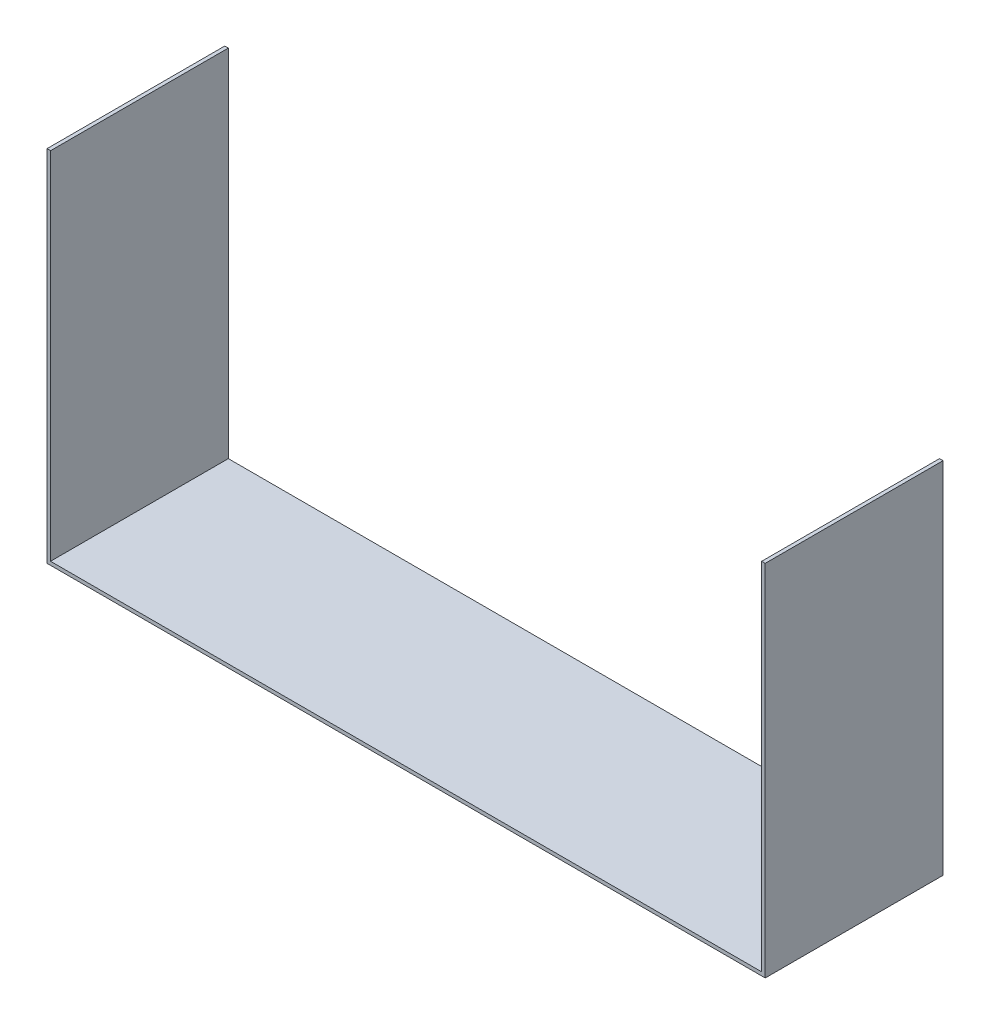
ISO-10303-21;
HEADER;
FILE_DESCRIPTION(('STEP AP214'),'2;1');
FILE_NAME('part.step','',(''),(''),'','','');
FILE_SCHEMA(('AUTOMOTIVE_DESIGN { 1 0 10303 214 1 1 1 1 }'));
ENDSEC;
DATA;
#1=APPLICATION_CONTEXT('core data for automotive mechanical design processes');
#2=APPLICATION_PROTOCOL_DEFINITION('international standard','automotive_design',2000,#1);
#3=PRODUCT_CONTEXT('',#1,'mechanical');
#4=PRODUCT('Part','Part','',(#3));
#5=PRODUCT_RELATED_PRODUCT_CATEGORY('part','',(#4));
#6=PRODUCT_DEFINITION_FORMATION('','',#4);
#7=PRODUCT_DEFINITION_CONTEXT('part definition',#1,'design');
#8=PRODUCT_DEFINITION('design','',#6,#7);
#9=PRODUCT_DEFINITION_SHAPE('','',#8);
#10=(LENGTH_UNIT() NAMED_UNIT(*) SI_UNIT(.MILLI.,.METRE.));
#11=(NAMED_UNIT(*) PLANE_ANGLE_UNIT() SI_UNIT($,.RADIAN.));
#12=(NAMED_UNIT(*) SI_UNIT($,.STERADIAN.) SOLID_ANGLE_UNIT());
#13=UNCERTAINTY_MEASURE_WITH_UNIT(LENGTH_MEASURE(1.E-05),#10,'distance_accuracy_value','');
#14=(GEOMETRIC_REPRESENTATION_CONTEXT(3) GLOBAL_UNCERTAINTY_ASSIGNED_CONTEXT((#13)) GLOBAL_UNIT_ASSIGNED_CONTEXT((#10,
#11,#12)) REPRESENTATION_CONTEXT('',''));
#15=CARTESIAN_POINT('',(0.,0.,0.));
#16=DIRECTION('',(0.,0.,1.));
#17=DIRECTION('',(1.,0.,0.));
#18=AXIS2_PLACEMENT_3D('',#15,#16,#17);
#19=CARTESIAN_POINT('',(-200.,0.,10000.));
#20=DIRECTION('',(0.,-1.,0.));
#21=DIRECTION('',(0.,0.,-1.));
#22=AXIS2_PLACEMENT_3D('',#19,#20,#21);
#23=PLANE('',#22);
#24=DIRECTION('',(-1.,0.,0.));
#25=VECTOR('',#24,1.);
#26=CARTESIAN_POINT('',(-200.,0.,0.));
#27=LINE('',#26,#25);
#28=CARTESIAN_POINT('',(0.,0.,0.));
#29=VERTEX_POINT('',#28);
#30=CARTESIAN_POINT('',(-200.,0.,0.));
#31=VERTEX_POINT('',#30);
#32=EDGE_CURVE('E144',#29,#31,#27,.T.);
#33=ORIENTED_EDGE('',*,*,#32,.T.);
#34=DIRECTION('',(0.,0.,-1.));
#35=VECTOR('',#34,1.);
#36=CARTESIAN_POINT('',(-200.,0.,10000.));
#37=LINE('',#36,#35);
#38=CARTESIAN_POINT('',(-200.,0.,10000.));
#39=VERTEX_POINT('',#38);
#40=EDGE_CURVE('E11',#39,#31,#37,.T.);
#41=ORIENTED_EDGE('',*,*,#40,.F.);
#42=DIRECTION('',(-1.,0.,0.));
#43=VECTOR('',#42,1.);
#44=CARTESIAN_POINT('',(-200.,0.,10000.));
#45=LINE('',#44,#43);
#46=CARTESIAN_POINT('',(0.,0.,10000.));
#47=VERTEX_POINT('',#46);
#48=EDGE_CURVE('E166',#47,#39,#45,.T.);
#49=ORIENTED_EDGE('',*,*,#48,.F.);
#50=DIRECTION('',(0.,0.,-1.));
#51=VECTOR('',#50,1.);
#52=CARTESIAN_POINT('',(0.,0.,10000.));
#53=LINE('',#52,#51);
#54=EDGE_CURVE('E140',#47,#29,#53,.T.);
#55=ORIENTED_EDGE('',*,*,#54,.T.);
#56=EDGE_LOOP('',(#33,#41,#49,#55));
#57=FACE_BOUND('',#56,.T.);
#58=ADVANCED_FACE('F43',(#57),#23,.F.);
#59=CARTESIAN_POINT('',(-200.,0.,10000.));
#60=DIRECTION('',(1.,0.,0.));
#61=DIRECTION('',(0.,0.,-1.));
#62=AXIS2_PLACEMENT_3D('',#59,#60,#61);
#63=PLANE('',#62);
#64=DIRECTION('',(0.,-1.,0.));
#65=VECTOR('',#64,1.);
#66=CARTESIAN_POINT('',(-200.,0.,0.));
#67=LINE('',#66,#65);
#68=CARTESIAN_POINT('',(-200.,-20200.,0.));
#69=VERTEX_POINT('',#68);
#70=EDGE_CURVE('E148',#31,#69,#67,.T.);
#71=ORIENTED_EDGE('',*,*,#70,.T.);
#72=DIRECTION('',(0.,0.,-1.));
#73=VECTOR('',#72,1.);
#74=CARTESIAN_POINT('',(-200.,-20200.,10000.));
#75=LINE('',#74,#73);
#76=CARTESIAN_POINT('',(-200.,-20200.,10000.));
#77=VERTEX_POINT('',#76);
#78=EDGE_CURVE('E52',#77,#69,#75,.T.);
#79=ORIENTED_EDGE('',*,*,#78,.F.);
#80=DIRECTION('',(0.,-1.,0.));
#81=VECTOR('',#80,1.);
#82=CARTESIAN_POINT('',(-200.,0.,10000.));
#83=LINE('',#82,#81);
#84=EDGE_CURVE('E103',#39,#77,#83,.T.);
#85=ORIENTED_EDGE('',*,*,#84,.F.);
#86=ORIENTED_EDGE('',*,*,#40,.T.);
#87=EDGE_LOOP('',(#71,#79,#85,#86));
#88=FACE_BOUND('',#87,.T.);
#89=ADVANCED_FACE('F212',(#88),#63,.F.);
#90=CARTESIAN_POINT('',(-200.,-20200.,10000.));
#91=DIRECTION('',(0.,1.,0.));
#92=DIRECTION('',(0.,0.,1.));
#93=AXIS2_PLACEMENT_3D('',#90,#91,#92);
#94=PLANE('',#93);
#95=DIRECTION('',(1.,0.,0.));
#96=VECTOR('',#95,1.);
#97=CARTESIAN_POINT('',(-200.,-20200.,0.));
#98=LINE('',#97,#96);
#99=CARTESIAN_POINT('',(40200.,-20200.,0.));
#100=VERTEX_POINT('',#99);
#101=EDGE_CURVE('E151',#69,#100,#98,.T.);
#102=ORIENTED_EDGE('',*,*,#101,.T.);
#103=DIRECTION('',(0.,0.,-1.));
#104=VECTOR('',#103,1.);
#105=CARTESIAN_POINT('',(40200.,-20200.,10000.));
#106=LINE('',#105,#104);
#107=CARTESIAN_POINT('',(40200.,-20200.,10000.));
#108=VERTEX_POINT('',#107);
#109=EDGE_CURVE('E177',#108,#100,#106,.T.);
#110=ORIENTED_EDGE('',*,*,#109,.F.);
#111=DIRECTION('',(1.,0.,0.));
#112=VECTOR('',#111,1.);
#113=CARTESIAN_POINT('',(-200.,-20200.,10000.));
#114=LINE('',#113,#112);
#115=EDGE_CURVE('E187',#77,#108,#114,.T.);
#116=ORIENTED_EDGE('',*,*,#115,.F.);
#117=ORIENTED_EDGE('',*,*,#78,.T.);
#118=EDGE_LOOP('',(#102,#110,#116,#117));
#119=FACE_BOUND('',#118,.T.);
#120=ADVANCED_FACE('F185',(#119),#94,.F.);
#121=CARTESIAN_POINT('',(40200.,-20200.,10000.));
#122=DIRECTION('',(-1.,0.,0.));
#123=DIRECTION('',(0.,0.,1.));
#124=AXIS2_PLACEMENT_3D('',#121,#122,#123);
#125=PLANE('',#124);
#126=DIRECTION('',(0.,1.,0.));
#127=VECTOR('',#126,1.);
#128=CARTESIAN_POINT('',(40200.,-20200.,0.));
#129=LINE('',#128,#127);
#130=CARTESIAN_POINT('',(40200.,0.,0.));
#131=VERTEX_POINT('',#130);
#132=EDGE_CURVE('E154',#100,#131,#129,.T.);
#133=ORIENTED_EDGE('',*,*,#132,.T.);
#134=DIRECTION('',(0.,0.,-1.));
#135=VECTOR('',#134,1.);
#136=CARTESIAN_POINT('',(40200.,0.,10000.));
#137=LINE('',#136,#135);
#138=CARTESIAN_POINT('',(40200.,0.,10000.));
#139=VERTEX_POINT('',#138);
#140=EDGE_CURVE('E173',#139,#131,#137,.T.);
#141=ORIENTED_EDGE('',*,*,#140,.F.);
#142=DIRECTION('',(0.,1.,0.));
#143=VECTOR('',#142,1.);
#144=CARTESIAN_POINT('',(40200.,-20200.,10000.));
#145=LINE('',#144,#143);
#146=EDGE_CURVE('E200',#108,#139,#145,.T.);
#147=ORIENTED_EDGE('',*,*,#146,.F.);
#148=ORIENTED_EDGE('',*,*,#109,.T.);
#149=EDGE_LOOP('',(#133,#141,#147,#148));
#150=FACE_BOUND('',#149,.T.);
#151=ADVANCED_FACE('F195',(#150),#125,.F.);
#152=CARTESIAN_POINT('',(40000.,0.,10000.));
#153=DIRECTION('',(0.,-1.,0.));
#154=DIRECTION('',(0.,0.,-1.));
#155=AXIS2_PLACEMENT_3D('',#152,#153,#154);
#156=PLANE('',#155);
#157=DIRECTION('',(-1.,0.,0.));
#158=VECTOR('',#157,1.);
#159=CARTESIAN_POINT('',(40000.,0.,0.));
#160=LINE('',#159,#158);
#161=CARTESIAN_POINT('',(40000.,0.,0.));
#162=VERTEX_POINT('',#161);
#163=EDGE_CURVE('E157',#131,#162,#160,.T.);
#164=ORIENTED_EDGE('',*,*,#163,.T.);
#165=DIRECTION('',(0.,0.,-1.));
#166=VECTOR('',#165,1.);
#167=CARTESIAN_POINT('',(40000.,0.,10000.));
#168=LINE('',#167,#166);
#169=CARTESIAN_POINT('',(40000.,0.,10000.));
#170=VERTEX_POINT('',#169);
#171=EDGE_CURVE('E133',#170,#162,#168,.T.);
#172=ORIENTED_EDGE('',*,*,#171,.F.);
#173=DIRECTION('',(-1.,0.,0.));
#174=VECTOR('',#173,1.);
#175=CARTESIAN_POINT('',(40000.,0.,10000.));
#176=LINE('',#175,#174);
#177=EDGE_CURVE('E122',#139,#170,#176,.T.);
#178=ORIENTED_EDGE('',*,*,#177,.F.);
#179=ORIENTED_EDGE('',*,*,#140,.T.);
#180=EDGE_LOOP('',(#164,#172,#178,#179));
#181=FACE_BOUND('',#180,.T.);
#182=ADVANCED_FACE('F198',(#181),#156,.F.);
#183=CARTESIAN_POINT('',(40000.,-20000.,10000.));
#184=DIRECTION('',(1.,0.,0.));
#185=DIRECTION('',(0.,0.,-1.));
#186=AXIS2_PLACEMENT_3D('',#183,#184,#185);
#187=PLANE('',#186);
#188=DIRECTION('',(0.,-1.,0.));
#189=VECTOR('',#188,1.);
#190=CARTESIAN_POINT('',(40000.,-20000.,0.));
#191=LINE('',#190,#189);
#192=CARTESIAN_POINT('',(40000.,-20000.,0.));
#193=VERTEX_POINT('',#192);
#194=EDGE_CURVE('E131',#162,#193,#191,.T.);
#195=ORIENTED_EDGE('',*,*,#194,.T.);
#196=DIRECTION('',(0.,0.,-1.));
#197=VECTOR('',#196,1.);
#198=CARTESIAN_POINT('',(40000.,-20000.,10000.));
#199=LINE('',#198,#197);
#200=CARTESIAN_POINT('',(40000.,-20000.,10000.));
#201=VERTEX_POINT('',#200);
#202=EDGE_CURVE('E128',#201,#193,#199,.T.);
#203=ORIENTED_EDGE('',*,*,#202,.F.);
#204=DIRECTION('',(0.,-1.,0.));
#205=VECTOR('',#204,1.);
#206=CARTESIAN_POINT('',(40000.,-20000.,10000.));
#207=LINE('',#206,#205);
#208=EDGE_CURVE('E116',#170,#201,#207,.T.);
#209=ORIENTED_EDGE('',*,*,#208,.F.);
#210=ORIENTED_EDGE('',*,*,#171,.T.);
#211=EDGE_LOOP('',(#195,#203,#209,#210));
#212=FACE_BOUND('',#211,.T.);
#213=ADVANCED_FACE('F129',(#212),#187,.F.);
#214=CARTESIAN_POINT('',(0.,-20000.,10000.));
#215=DIRECTION('',(0.,-1.,0.));
#216=DIRECTION('',(0.,0.,-1.));
#217=AXIS2_PLACEMENT_3D('',#214,#215,#216);
#218=PLANE('',#217);
#219=DIRECTION('',(-1.,0.,0.));
#220=VECTOR('',#219,1.);
#221=CARTESIAN_POINT('',(0.,-20000.,0.));
#222=LINE('',#221,#220);
#223=CARTESIAN_POINT('',(0.,-20000.,0.));
#224=VERTEX_POINT('',#223);
#225=EDGE_CURVE('E89',#193,#224,#222,.T.);
#226=ORIENTED_EDGE('',*,*,#225,.T.);
#227=DIRECTION('',(0.,0.,-1.));
#228=VECTOR('',#227,1.);
#229=CARTESIAN_POINT('',(0.,-20000.,10000.));
#230=LINE('',#229,#228);
#231=CARTESIAN_POINT('',(0.,-20000.,10000.));
#232=VERTEX_POINT('',#231);
#233=EDGE_CURVE('E134',#232,#224,#230,.T.);
#234=ORIENTED_EDGE('',*,*,#233,.F.);
#235=DIRECTION('',(-1.,0.,0.));
#236=VECTOR('',#235,1.);
#237=CARTESIAN_POINT('',(0.,-20000.,10000.));
#238=LINE('',#237,#236);
#239=EDGE_CURVE('E120',#201,#232,#238,.T.);
#240=ORIENTED_EDGE('',*,*,#239,.F.);
#241=ORIENTED_EDGE('',*,*,#202,.T.);
#242=EDGE_LOOP('',(#226,#234,#240,#241));
#243=FACE_BOUND('',#242,.T.);
#244=ADVANCED_FACE('F136',(#243),#218,.F.);
#245=CARTESIAN_POINT('',(0.,0.,10000.));
#246=DIRECTION('',(-1.,0.,0.));
#247=DIRECTION('',(0.,0.,1.));
#248=AXIS2_PLACEMENT_3D('',#245,#246,#247);
#249=PLANE('',#248);
#250=DIRECTION('',(0.,1.,0.));
#251=VECTOR('',#250,1.);
#252=CARTESIAN_POINT('',(0.,0.,0.));
#253=LINE('',#252,#251);
#254=EDGE_CURVE('E95',#224,#29,#253,.T.);
#255=ORIENTED_EDGE('',*,*,#254,.T.);
#256=ORIENTED_EDGE('',*,*,#54,.F.);
#257=DIRECTION('',(0.,1.,0.));
#258=VECTOR('',#257,1.);
#259=CARTESIAN_POINT('',(0.,0.,10000.));
#260=LINE('',#259,#258);
#261=EDGE_CURVE('E60',#232,#47,#260,.T.);
#262=ORIENTED_EDGE('',*,*,#261,.F.);
#263=ORIENTED_EDGE('',*,*,#233,.T.);
#264=EDGE_LOOP('',(#255,#256,#262,#263));
#265=FACE_BOUND('',#264,.T.);
#266=ADVANCED_FACE('F228',(#265),#249,.F.);
#267=CARTESIAN_POINT('',(0.,0.,10000.));
#268=DIRECTION('',(0.,0.,-1.));
#269=DIRECTION('',(-1.,0.,0.));
#270=AXIS2_PLACEMENT_3D('',#267,#268,#269);
#271=PLANE('',#270);
#272=ORIENTED_EDGE('',*,*,#48,.T.);
#273=ORIENTED_EDGE('',*,*,#84,.T.);
#274=ORIENTED_EDGE('',*,*,#115,.T.);
#275=ORIENTED_EDGE('',*,*,#146,.T.);
#276=ORIENTED_EDGE('',*,*,#177,.T.);
#277=ORIENTED_EDGE('',*,*,#208,.T.);
#278=ORIENTED_EDGE('',*,*,#239,.T.);
#279=ORIENTED_EDGE('',*,*,#261,.T.);
#280=EDGE_LOOP('',(#272,#273,#274,#275,#276,#277,#278,#279));
#281=FACE_BOUND('',#280,.T.);
#282=ADVANCED_FACE('F118',(#281),#271,.F.);
#283=CARTESIAN_POINT('',(0.,0.,0.));
#284=DIRECTION('',(0.,0.,-1.));
#285=DIRECTION('',(-1.,0.,0.));
#286=AXIS2_PLACEMENT_3D('',#283,#284,#285);
#287=PLANE('',#286);
#288=ORIENTED_EDGE('',*,*,#32,.F.);
#289=ORIENTED_EDGE('',*,*,#254,.F.);
#290=ORIENTED_EDGE('',*,*,#225,.F.);
#291=ORIENTED_EDGE('',*,*,#194,.F.);
#292=ORIENTED_EDGE('',*,*,#163,.F.);
#293=ORIENTED_EDGE('',*,*,#132,.F.);
#294=ORIENTED_EDGE('',*,*,#101,.F.);
#295=ORIENTED_EDGE('',*,*,#70,.F.);
#296=EDGE_LOOP('',(#288,#289,#290,#291,#292,#293,#294,#295));
#297=FACE_BOUND('',#296,.T.);
#298=ADVANCED_FACE('F191',(#297),#287,.T.);
#299=CLOSED_SHELL('',(#58,#89,#120,#151,#182,#213,#244,#266,#282,#298));
#300=MANIFOLD_SOLID_BREP('B2',#299);
#301=ADVANCED_BREP_SHAPE_REPRESENTATION('',(#18,#300),#14);
#302=SHAPE_DEFINITION_REPRESENTATION(#9,#301);
ENDSEC;
END-ISO-10303-21;
